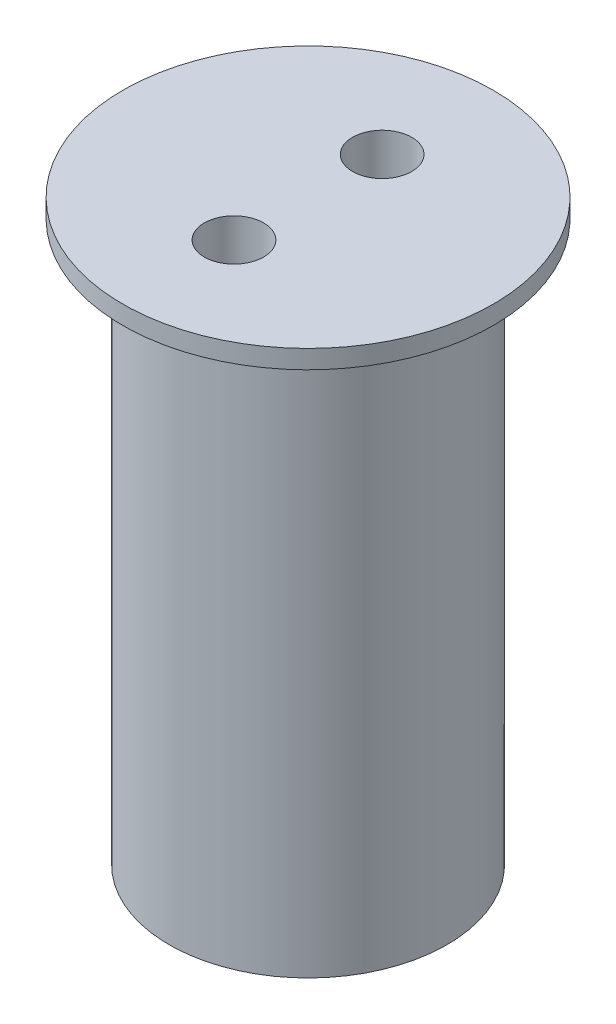
ISO-10303-21;
HEADER;
FILE_DESCRIPTION(('STEP AP214'),'2;1');
FILE_NAME('part.step','',(''),(''),'','','');
FILE_SCHEMA(('AUTOMOTIVE_DESIGN { 1 0 10303 214 1 1 1 1 }'));
ENDSEC;
DATA;
#1=APPLICATION_CONTEXT('core data for automotive mechanical design processes');
#2=APPLICATION_PROTOCOL_DEFINITION('international standard','automotive_design',2000,#1);
#3=PRODUCT_CONTEXT('',#1,'mechanical');
#4=PRODUCT('Part','Part','',(#3));
#5=PRODUCT_RELATED_PRODUCT_CATEGORY('part','',(#4));
#6=PRODUCT_DEFINITION_FORMATION('','',#4);
#7=PRODUCT_DEFINITION_CONTEXT('part definition',#1,'design');
#8=PRODUCT_DEFINITION('design','',#6,#7);
#9=PRODUCT_DEFINITION_SHAPE('','',#8);
#10=(LENGTH_UNIT() NAMED_UNIT(*) SI_UNIT(.MILLI.,.METRE.));
#11=(NAMED_UNIT(*) PLANE_ANGLE_UNIT() SI_UNIT($,.RADIAN.));
#12=(NAMED_UNIT(*) SI_UNIT($,.STERADIAN.) SOLID_ANGLE_UNIT());
#13=UNCERTAINTY_MEASURE_WITH_UNIT(LENGTH_MEASURE(1.E-05),#10,'distance_accuracy_value','');
#14=(GEOMETRIC_REPRESENTATION_CONTEXT(3) GLOBAL_UNCERTAINTY_ASSIGNED_CONTEXT((#13)) GLOBAL_UNIT_ASSIGNED_CONTEXT((#10,
#11,#12)) REPRESENTATION_CONTEXT('',''));
#15=CARTESIAN_POINT('',(0.,0.,0.));
#16=DIRECTION('',(0.,0.,1.));
#17=DIRECTION('',(1.,0.,0.));
#18=AXIS2_PLACEMENT_3D('',#15,#16,#17);
#19=CARTESIAN_POINT('',(0.,14.96953125,0.));
#20=DIRECTION('',(0.,1.,0.));
#21=DIRECTION('',(0.,0.,1.));
#22=AXIS2_PLACEMENT_3D('',#19,#20,#21);
#23=PLANE('',#22);
#24=CARTESIAN_POINT('',(0.,14.96953125,4.));
#25=DIRECTION('',(0.,1.,0.));
#26=DIRECTION('',(0.,0.,1.));
#27=AXIS2_PLACEMENT_3D('',#24,#25,#26);
#28=CIRCLE('',#27,1.6);
#29=CARTESIAN_POINT('',(0.,14.96953125,5.6));
#30=VERTEX_POINT('',#29);
#31=EDGE_CURVE('E59',#30,#30,#28,.T.);
#32=ORIENTED_EDGE('',*,*,#31,.F.);
#33=EDGE_LOOP('',(#32));
#34=FACE_BOUND('',#33,.T.);
#35=CARTESIAN_POINT('',(0.,14.96953125,-4.));
#36=DIRECTION('',(0.,1.,0.));
#37=DIRECTION('',(0.,0.,1.));
#38=AXIS2_PLACEMENT_3D('',#35,#36,#37);
#39=CIRCLE('',#38,1.6);
#40=CARTESIAN_POINT('',(0.,14.96953125,-2.4));
#41=VERTEX_POINT('',#40);
#42=EDGE_CURVE('E62',#41,#41,#39,.T.);
#43=ORIENTED_EDGE('',*,*,#42,.F.);
#44=EDGE_LOOP('',(#43));
#45=FACE_BOUND('',#44,.T.);
#46=CARTESIAN_POINT('',(0.,14.96953125,0.));
#47=DIRECTION('',(0.,-1.,0.));
#48=DIRECTION('',(0.,0.,-1.));
#49=AXIS2_PLACEMENT_3D('',#46,#47,#48);
#50=CIRCLE('',#49,10.);
#51=CARTESIAN_POINT('',(0.,14.96953125,-10.));
#52=VERTEX_POINT('',#51);
#53=EDGE_CURVE('E10',#52,#52,#50,.T.);
#54=ORIENTED_EDGE('',*,*,#53,.F.);
#55=EDGE_LOOP('',(#54));
#56=FACE_BOUND('',#55,.T.);
#57=ADVANCED_FACE('F39',(#34,#45,#56),#23,.T.);
#58=CARTESIAN_POINT('',(0.,-16.23046875,0.));
#59=DIRECTION('',(0.,-1.,0.));
#60=DIRECTION('',(0.,0.,-1.));
#61=AXIS2_PLACEMENT_3D('',#58,#59,#60);
#62=CYLINDRICAL_SURFACE('',#61,10.);
#63=ORIENTED_EDGE('',*,*,#53,.T.);
#64=EDGE_LOOP('',(#63));
#65=FACE_BOUND('',#64,.T.);
#66=CARTESIAN_POINT('',(0.,13.96953125,0.));
#67=DIRECTION('',(0.,-1.,0.));
#68=DIRECTION('',(0.,0.,-1.));
#69=AXIS2_PLACEMENT_3D('',#66,#67,#68);
#70=CIRCLE('',#69,10.);
#71=CARTESIAN_POINT('',(0.,13.96953125,-10.));
#72=VERTEX_POINT('',#71);
#73=EDGE_CURVE('E44',#72,#72,#70,.T.);
#74=ORIENTED_EDGE('',*,*,#73,.F.);
#75=EDGE_LOOP('',(#74));
#76=FACE_BOUND('',#75,.T.);
#77=ADVANCED_FACE('F92',(#65,#76),#62,.T.);
#78=CARTESIAN_POINT('',(10.,13.96953125,0.));
#79=DIRECTION('',(0.,-1.,0.));
#80=DIRECTION('',(0.,0.,-1.));
#81=AXIS2_PLACEMENT_3D('',#78,#79,#80);
#82=PLANE('',#81);
#83=ORIENTED_EDGE('',*,*,#73,.T.);
#84=EDGE_LOOP('',(#83));
#85=FACE_BOUND('',#84,.T.);
#86=CARTESIAN_POINT('',(0.,13.96953125,0.));
#87=DIRECTION('',(0.,-1.,0.));
#88=DIRECTION('',(0.,0.,-1.));
#89=AXIS2_PLACEMENT_3D('',#86,#87,#88);
#90=CIRCLE('',#89,7.5);
#91=CARTESIAN_POINT('',(0.,13.96953125,-7.5));
#92=VERTEX_POINT('',#91);
#93=EDGE_CURVE('E47',#92,#92,#90,.T.);
#94=ORIENTED_EDGE('',*,*,#93,.F.);
#95=EDGE_LOOP('',(#94));
#96=FACE_BOUND('',#95,.T.);
#97=ADVANCED_FACE('F81',(#85,#96),#82,.T.);
#98=CARTESIAN_POINT('',(0.,-16.23046875,0.));
#99=DIRECTION('',(0.,-1.,0.));
#100=DIRECTION('',(0.,0.,-1.));
#101=AXIS2_PLACEMENT_3D('',#98,#99,#100);
#102=CYLINDRICAL_SURFACE('',#101,7.5);
#103=ORIENTED_EDGE('',*,*,#93,.T.);
#104=EDGE_LOOP('',(#103));
#105=FACE_BOUND('',#104,.T.);
#106=CARTESIAN_POINT('',(0.,-16.23046875,0.));
#107=DIRECTION('',(0.,-1.,0.));
#108=DIRECTION('',(0.,0.,-1.));
#109=AXIS2_PLACEMENT_3D('',#106,#107,#108);
#110=CIRCLE('',#109,7.5);
#111=CARTESIAN_POINT('',(0.,-16.23046875,-7.5));
#112=VERTEX_POINT('',#111);
#113=EDGE_CURVE('E52',#112,#112,#110,.T.);
#114=ORIENTED_EDGE('',*,*,#113,.F.);
#115=EDGE_LOOP('',(#114));
#116=FACE_BOUND('',#115,.T.);
#117=ADVANCED_FACE('F80',(#105,#116),#102,.T.);
#118=CARTESIAN_POINT('',(7.5,-16.23046875,0.));
#119=DIRECTION('',(0.,-1.,0.));
#120=DIRECTION('',(0.,0.,-1.));
#121=AXIS2_PLACEMENT_3D('',#118,#119,#120);
#122=PLANE('',#121);
#123=CARTESIAN_POINT('',(0.,-16.23046875,4.));
#124=DIRECTION('',(0.,-1.,0.));
#125=DIRECTION('',(0.,0.,-1.));
#126=AXIS2_PLACEMENT_3D('',#123,#124,#125);
#127=CIRCLE('',#126,1.6);
#128=CARTESIAN_POINT('',(0.,-16.23046875,2.4));
#129=VERTEX_POINT('',#128);
#130=EDGE_CURVE('E61',#129,#129,#127,.T.);
#131=ORIENTED_EDGE('',*,*,#130,.F.);
#132=EDGE_LOOP('',(#131));
#133=FACE_BOUND('',#132,.T.);
#134=CARTESIAN_POINT('',(0.,-16.23046875,-4.));
#135=DIRECTION('',(0.,-1.,0.));
#136=DIRECTION('',(0.,0.,-1.));
#137=AXIS2_PLACEMENT_3D('',#134,#135,#136);
#138=CIRCLE('',#137,1.6);
#139=CARTESIAN_POINT('',(0.,-16.23046875,-5.6));
#140=VERTEX_POINT('',#139);
#141=EDGE_CURVE('E63',#140,#140,#138,.T.);
#142=ORIENTED_EDGE('',*,*,#141,.F.);
#143=EDGE_LOOP('',(#142));
#144=FACE_BOUND('',#143,.T.);
#145=ORIENTED_EDGE('',*,*,#113,.T.);
#146=EDGE_LOOP('',(#145));
#147=FACE_BOUND('',#146,.T.);
#148=ADVANCED_FACE('F73',(#133,#144,#147),#122,.T.);
#149=CARTESIAN_POINT('',(0.,25.76953125,-4.));
#150=DIRECTION('',(0.,-1.,0.));
#151=DIRECTION('',(0.,0.,-1.));
#152=AXIS2_PLACEMENT_3D('',#149,#150,#151);
#153=CYLINDRICAL_SURFACE('',#152,1.6);
#154=ORIENTED_EDGE('',*,*,#42,.T.);
#155=EDGE_LOOP('',(#154));
#156=FACE_BOUND('',#155,.T.);
#157=ORIENTED_EDGE('',*,*,#141,.T.);
#158=EDGE_LOOP('',(#157));
#159=FACE_BOUND('',#158,.T.);
#160=ADVANCED_FACE('F77',(#156,#159),#153,.F.);
#161=CARTESIAN_POINT('',(0.,25.76953125,4.));
#162=DIRECTION('',(0.,-1.,0.));
#163=DIRECTION('',(0.,0.,-1.));
#164=AXIS2_PLACEMENT_3D('',#161,#162,#163);
#165=CYLINDRICAL_SURFACE('',#164,1.6);
#166=ORIENTED_EDGE('',*,*,#31,.T.);
#167=EDGE_LOOP('',(#166));
#168=FACE_BOUND('',#167,.T.);
#169=ORIENTED_EDGE('',*,*,#130,.T.);
#170=EDGE_LOOP('',(#169));
#171=FACE_BOUND('',#170,.T.);
#172=ADVANCED_FACE('F72',(#168,#171),#165,.F.);
#173=CLOSED_SHELL('',(#57,#77,#97,#117,#148,#160,#172));
#174=MANIFOLD_SOLID_BREP('B2',#173);
#175=ADVANCED_BREP_SHAPE_REPRESENTATION('',(#18,#174),#14);
#176=SHAPE_DEFINITION_REPRESENTATION(#9,#175);
ENDSEC;
END-ISO-10303-21;
